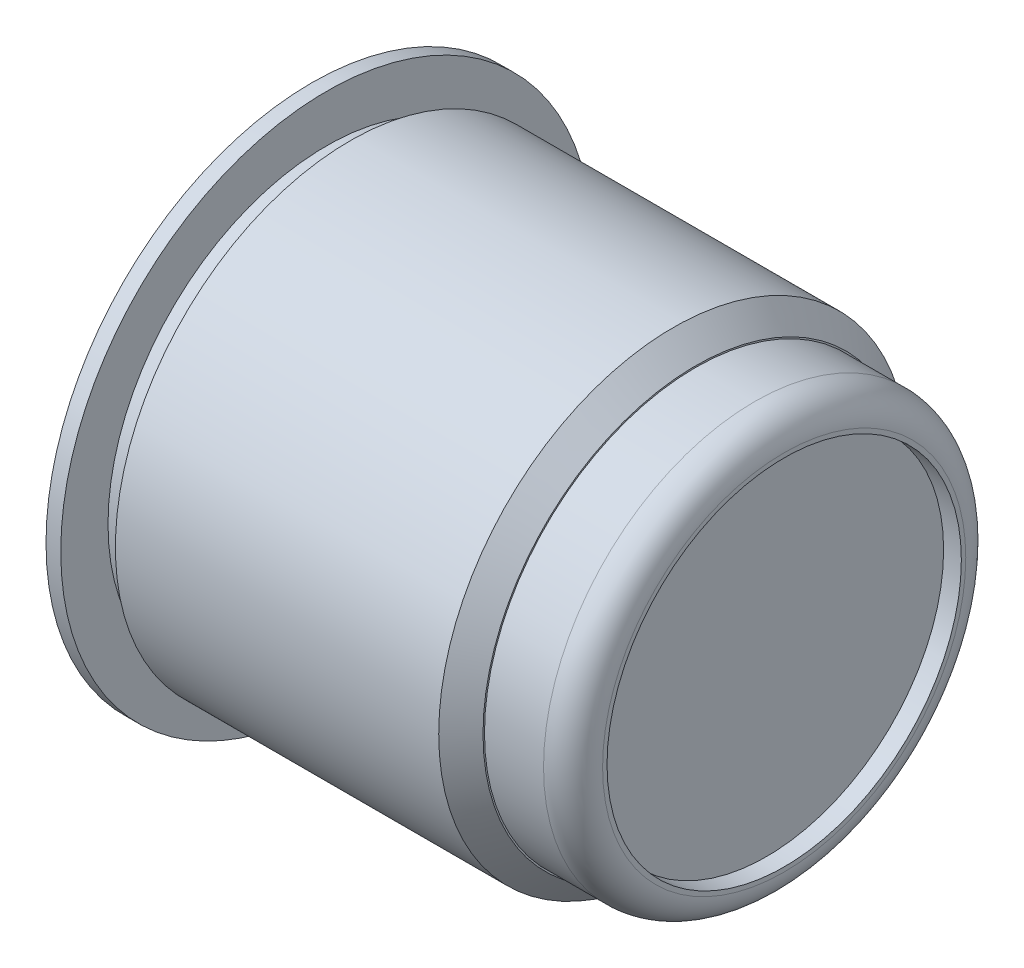
ISO-10303-21;
HEADER;
FILE_DESCRIPTION(('STEP AP214'),'2;1');
FILE_NAME('part.step','',(''),(''),'','','');
FILE_SCHEMA(('AUTOMOTIVE_DESIGN { 1 0 10303 214 1 1 1 1 }'));
ENDSEC;
DATA;
#1=APPLICATION_CONTEXT('core data for automotive mechanical design processes');
#2=APPLICATION_PROTOCOL_DEFINITION('international standard','automotive_design',2000,#1);
#3=PRODUCT_CONTEXT('',#1,'mechanical');
#4=PRODUCT('Part','Part','',(#3));
#5=PRODUCT_RELATED_PRODUCT_CATEGORY('part','',(#4));
#6=PRODUCT_DEFINITION_FORMATION('','',#4);
#7=PRODUCT_DEFINITION_CONTEXT('part definition',#1,'design');
#8=PRODUCT_DEFINITION('design','',#6,#7);
#9=PRODUCT_DEFINITION_SHAPE('','',#8);
#10=(LENGTH_UNIT() NAMED_UNIT(*) SI_UNIT(.MILLI.,.METRE.));
#11=(NAMED_UNIT(*) PLANE_ANGLE_UNIT() SI_UNIT($,.RADIAN.));
#12=(NAMED_UNIT(*) SI_UNIT($,.STERADIAN.) SOLID_ANGLE_UNIT());
#13=UNCERTAINTY_MEASURE_WITH_UNIT(LENGTH_MEASURE(1.E-05),#10,'distance_accuracy_value','');
#14=(GEOMETRIC_REPRESENTATION_CONTEXT(3) GLOBAL_UNCERTAINTY_ASSIGNED_CONTEXT((#13)) GLOBAL_UNIT_ASSIGNED_CONTEXT((#10,
#11,#12)) REPRESENTATION_CONTEXT('',''));
#15=CARTESIAN_POINT('',(0.,0.,0.));
#16=DIRECTION('',(0.,0.,1.));
#17=DIRECTION('',(1.,0.,0.));
#18=AXIS2_PLACEMENT_3D('',#15,#16,#17);
#19=CARTESIAN_POINT('',(12.5,0.,0.));
#20=DIRECTION('',(1.,0.,0.));
#21=DIRECTION('',(0.,0.,-1.));
#22=AXIS2_PLACEMENT_3D('',#19,#20,#21);
#23=PLANE('',#22);
#24=CARTESIAN_POINT('',(12.5,0.,0.));
#25=DIRECTION('',(-1.,0.,0.));
#26=DIRECTION('',(0.,0.,1.));
#27=AXIS2_PLACEMENT_3D('',#24,#25,#26);
#28=CIRCLE('',#27,5.95);
#29=CARTESIAN_POINT('',(12.5,0.,5.95));
#30=VERTEX_POINT('',#29);
#31=EDGE_CURVE('E17',#30,#30,#28,.T.);
#32=ORIENTED_EDGE('',*,*,#31,.T.);
#33=EDGE_LOOP('',(#32));
#34=FACE_BOUND('',#33,.T.);
#35=ADVANCED_FACE('F14',(#34),#23,.F.);
#36=CARTESIAN_POINT('',(-1.,0.,0.));
#37=DIRECTION('',(-1.,0.,0.));
#38=DIRECTION('',(0.,0.,1.));
#39=AXIS2_PLACEMENT_3D('',#36,#37,#38);
#40=CYLINDRICAL_SURFACE('',#39,5.95);
#41=CARTESIAN_POINT('',(-1.5,0.,0.));
#42=DIRECTION('',(-1.,0.,0.));
#43=DIRECTION('',(0.,0.,1.));
#44=AXIS2_PLACEMENT_3D('',#41,#42,#43);
#45=CIRCLE('',#44,5.95);
#46=CARTESIAN_POINT('',(-1.5,0.,5.95));
#47=VERTEX_POINT('',#46);
#48=EDGE_CURVE('E86',#47,#47,#45,.F.);
#49=ORIENTED_EDGE('',*,*,#48,.F.);
#50=EDGE_LOOP('',(#49));
#51=FACE_BOUND('',#50,.T.);
#52=ORIENTED_EDGE('',*,*,#31,.F.);
#53=EDGE_LOOP('',(#52));
#54=FACE_BOUND('',#53,.T.);
#55=ADVANCED_FACE('F94',(#51,#54),#40,.F.);
#56=CARTESIAN_POINT('',(14.9,0.,0.));
#57=DIRECTION('',(-1.,0.,0.));
#58=DIRECTION('',(0.,0.,1.));
#59=AXIS2_PLACEMENT_3D('',#56,#57,#58);
#60=PLANE('',#59);
#61=CARTESIAN_POINT('',(14.9,0.,0.));
#62=DIRECTION('',(-1.,0.,0.));
#63=DIRECTION('',(0.,0.,1.));
#64=AXIS2_PLACEMENT_3D('',#61,#62,#63);
#65=CIRCLE('',#64,6.);
#66=CARTESIAN_POINT('',(14.9,0.,6.));
#67=VERTEX_POINT('',#66);
#68=EDGE_CURVE('E84',#67,#67,#65,.F.);
#69=ORIENTED_EDGE('',*,*,#68,.T.);
#70=EDGE_LOOP('',(#69));
#71=FACE_BOUND('',#70,.T.);
#72=ADVANCED_FACE('F96',(#71),#60,.F.);
#73=CARTESIAN_POINT('',(-1.5,0.,6.475));
#74=DIRECTION('',(-1.,0.,0.));
#75=DIRECTION('',(0.,0.,1.));
#76=AXIS2_PLACEMENT_3D('',#73,#74,#75);
#77=PLANE('',#76);
#78=ORIENTED_EDGE('',*,*,#48,.T.);
#79=EDGE_LOOP('',(#78));
#80=FACE_BOUND('',#79,.T.);
#81=CARTESIAN_POINT('',(-1.5000000012651,0.,0.));
#82=DIRECTION('',(1.,0.,0.));
#83=DIRECTION('',(0.,1.,0.));
#84=AXIS2_PLACEMENT_3D('',#81,#82,#83);
#85=CIRCLE('',#84,7.00000000063255);
#86=CARTESIAN_POINT('',(-1.5000000012651,7.00000000063255,0.));
#87=VERTEX_POINT('',#86);
#88=EDGE_CURVE('E81',#87,#87,#85,.T.);
#89=ORIENTED_EDGE('',*,*,#88,.F.);
#90=EDGE_LOOP('',(#89));
#91=FACE_BOUND('',#90,.T.);
#92=ADVANCED_FACE('F103',(#80,#91),#77,.T.);
#93=CARTESIAN_POINT('',(15.5,0.,0.));
#94=DIRECTION('',(-1.,0.,0.));
#95=DIRECTION('',(0.,0.,1.));
#96=AXIS2_PLACEMENT_3D('',#93,#94,#95);
#97=CYLINDRICAL_SURFACE('',#96,6.);
#98=CARTESIAN_POINT('',(15.5,0.,0.));
#99=DIRECTION('',(-1.,0.,0.));
#100=DIRECTION('',(0.,0.,1.));
#101=AXIS2_PLACEMENT_3D('',#98,#99,#100);
#102=CIRCLE('',#101,6.);
#103=CARTESIAN_POINT('',(15.5,0.,6.));
#104=VERTEX_POINT('',#103);
#105=EDGE_CURVE('E78',#104,#104,#102,.F.);
#106=ORIENTED_EDGE('',*,*,#105,.T.);
#107=EDGE_LOOP('',(#106));
#108=FACE_BOUND('',#107,.T.);
#109=ORIENTED_EDGE('',*,*,#68,.F.);
#110=EDGE_LOOP('',(#109));
#111=FACE_BOUND('',#110,.T.);
#112=ADVANCED_FACE('F172',(#108,#111),#97,.F.);
#113=CARTESIAN_POINT('',(-0.499999998734898,0.,0.));
#114=DIRECTION('',(1.,0.,0.));
#115=DIRECTION('',(0.,1.,0.));
#116=AXIS2_PLACEMENT_3D('',#113,#114,#115);
#117=CONICAL_SURFACE('',#116,8.99999999936745,1.10714871652899);
#118=CARTESIAN_POINT('',(-0.5,0.,0.));
#119=DIRECTION('',(-1.,0.,0.));
#120=DIRECTION('',(0.,0.,1.));
#121=AXIS2_PLACEMENT_3D('',#118,#119,#120);
#122=CIRCLE('',#121,9.);
#123=CARTESIAN_POINT('',(-0.5,0.,9.));
#124=VERTEX_POINT('',#123);
#125=EDGE_CURVE('E40',#124,#124,#122,.F.);
#126=ORIENTED_EDGE('',*,*,#125,.F.);
#127=EDGE_LOOP('',(#126));
#128=FACE_BOUND('',#127,.T.);
#129=ORIENTED_EDGE('',*,*,#88,.T.);
#130=EDGE_LOOP('',(#129));
#131=FACE_BOUND('',#130,.T.);
#132=ADVANCED_FACE('F168',(#128,#131),#117,.T.);
#133=CARTESIAN_POINT('',(15.5,0.,0.));
#134=DIRECTION('',(-1.,0.,0.));
#135=DIRECTION('',(0.,0.,1.));
#136=AXIS2_PLACEMENT_3D('',#133,#134,#135);
#137=PLANE('',#136);
#138=ORIENTED_EDGE('',*,*,#105,.F.);
#139=EDGE_LOOP('',(#138));
#140=FACE_BOUND('',#139,.T.);
#141=CARTESIAN_POINT('',(15.5,0.,0.));
#142=DIRECTION('',(-1.,0.,0.));
#143=DIRECTION('',(0.,0.,1.));
#144=AXIS2_PLACEMENT_3D('',#141,#142,#143);
#145=CIRCLE('',#144,6.15);
#146=CARTESIAN_POINT('',(15.5,0.,6.15));
#147=VERTEX_POINT('',#146);
#148=EDGE_CURVE('E77',#147,#147,#145,.T.);
#149=ORIENTED_EDGE('',*,*,#148,.F.);
#150=EDGE_LOOP('',(#149));
#151=FACE_BOUND('',#150,.T.);
#152=ADVANCED_FACE('F150',(#140,#151),#137,.F.);
#153=CARTESIAN_POINT('',(0.,0.,0.));
#154=DIRECTION('',(-1.,0.,0.));
#155=DIRECTION('',(0.,0.,1.));
#156=AXIS2_PLACEMENT_3D('',#153,#154,#155);
#157=CYLINDRICAL_SURFACE('',#156,9.);
#158=CARTESIAN_POINT('',(0.,0.,0.));
#159=DIRECTION('',(-1.,0.,0.));
#160=DIRECTION('',(0.,0.,1.));
#161=AXIS2_PLACEMENT_3D('',#158,#159,#160);
#162=CIRCLE('',#161,9.);
#163=CARTESIAN_POINT('',(0.,0.,9.));
#164=VERTEX_POINT('',#163);
#165=EDGE_CURVE('E35',#164,#164,#162,.T.);
#166=ORIENTED_EDGE('',*,*,#165,.T.);
#167=EDGE_LOOP('',(#166));
#168=FACE_BOUND('',#167,.T.);
#169=ORIENTED_EDGE('',*,*,#125,.T.);
#170=EDGE_LOOP('',(#169));
#171=FACE_BOUND('',#170,.T.);
#172=ADVANCED_FACE('F49',(#168,#171),#157,.T.);
#173=CARTESIAN_POINT('',(14.5,0.,0.));
#174=DIRECTION('',(1.,0.,0.));
#175=DIRECTION('',(0.,0.,-1.));
#176=AXIS2_PLACEMENT_3D('',#173,#174,#175);
#177=TOROIDAL_SURFACE('',#176,6.15,1.);
#178=ORIENTED_EDGE('',*,*,#148,.T.);
#179=EDGE_LOOP('',(#178));
#180=FACE_BOUND('',#179,.T.);
#181=CARTESIAN_POINT('',(14.5,0.,0.));
#182=DIRECTION('',(1.,0.,0.));
#183=DIRECTION('',(0.,0.,-1.));
#184=AXIS2_PLACEMENT_3D('',#181,#182,#183);
#185=CIRCLE('',#184,7.15);
#186=CARTESIAN_POINT('',(14.5,0.,-7.15));
#187=VERTEX_POINT('',#186);
#188=EDGE_CURVE('E31',#187,#187,#185,.F.);
#189=ORIENTED_EDGE('',*,*,#188,.F.);
#190=EDGE_LOOP('',(#189));
#191=FACE_BOUND('',#190,.T.);
#192=ADVANCED_FACE('F43',(#180,#191),#177,.T.);
#193=CARTESIAN_POINT('',(0.,0.,0.));
#194=DIRECTION('',(-1.,0.,0.));
#195=DIRECTION('',(0.,0.,1.));
#196=AXIS2_PLACEMENT_3D('',#193,#194,#195);
#197=PLANE('',#196);
#198=CARTESIAN_POINT('',(0.,0.,0.));
#199=DIRECTION('',(1.,0.,0.));
#200=DIRECTION('',(0.,0.,-1.));
#201=AXIS2_PLACEMENT_3D('',#198,#199,#200);
#202=CIRCLE('',#201,7.4);
#203=CARTESIAN_POINT('',(0.,0.,-7.4));
#204=VERTEX_POINT('',#203);
#205=EDGE_CURVE('E34',#204,#204,#202,.T.);
#206=ORIENTED_EDGE('',*,*,#205,.F.);
#207=EDGE_LOOP('',(#206));
#208=FACE_BOUND('',#207,.T.);
#209=ORIENTED_EDGE('',*,*,#165,.F.);
#210=EDGE_LOOP('',(#209));
#211=FACE_BOUND('',#210,.T.);
#212=ADVANCED_FACE('F48',(#208,#211),#197,.F.);
#213=CARTESIAN_POINT('',(13.5,0.,0.));
#214=DIRECTION('',(1.,0.,0.));
#215=DIRECTION('',(0.,0.,-1.));
#216=AXIS2_PLACEMENT_3D('',#213,#214,#215);
#217=CYLINDRICAL_SURFACE('',#216,7.15);
#218=ORIENTED_EDGE('',*,*,#188,.T.);
#219=EDGE_LOOP('',(#218));
#220=FACE_BOUND('',#219,.T.);
#221=CARTESIAN_POINT('',(12.5,0.,0.));
#222=DIRECTION('',(1.,0.,0.));
#223=DIRECTION('',(0.,0.,-1.));
#224=AXIS2_PLACEMENT_3D('',#221,#222,#223);
#225=CIRCLE('',#224,7.15);
#226=CARTESIAN_POINT('',(12.5,0.,-7.15));
#227=VERTEX_POINT('',#226);
#228=EDGE_CURVE('E70',#227,#227,#225,.T.);
#229=ORIENTED_EDGE('',*,*,#228,.T.);
#230=EDGE_LOOP('',(#229));
#231=FACE_BOUND('',#230,.T.);
#232=ADVANCED_FACE('F127',(#220,#231),#217,.T.);
#233=CARTESIAN_POINT('',(0.,0.,0.));
#234=DIRECTION('',(1.,0.,0.));
#235=DIRECTION('',(0.,0.,-1.));
#236=AXIS2_PLACEMENT_3D('',#233,#234,#235);
#237=CYLINDRICAL_SURFACE('',#236,7.4);
#238=ORIENTED_EDGE('',*,*,#205,.T.);
#239=EDGE_LOOP('',(#238));
#240=FACE_BOUND('',#239,.T.);
#241=CARTESIAN_POINT('',(0.8,0.,0.));
#242=DIRECTION('',(1.,0.,0.));
#243=DIRECTION('',(0.,0.,-1.));
#244=AXIS2_PLACEMENT_3D('',#241,#242,#243);
#245=CIRCLE('',#244,7.4);
#246=CARTESIAN_POINT('',(0.8,0.,-7.4));
#247=VERTEX_POINT('',#246);
#248=EDGE_CURVE('E67',#247,#247,#245,.T.);
#249=ORIENTED_EDGE('',*,*,#248,.F.);
#250=EDGE_LOOP('',(#249));
#251=FACE_BOUND('',#250,.T.);
#252=ADVANCED_FACE('F124',(#240,#251),#237,.T.);
#253=CARTESIAN_POINT('',(12.5,0.,7.55));
#254=DIRECTION('',(-1.,0.,0.));
#255=DIRECTION('',(0.,0.,1.));
#256=AXIS2_PLACEMENT_3D('',#253,#254,#255);
#257=PLANE('',#256);
#258=ORIENTED_EDGE('',*,*,#228,.F.);
#259=EDGE_LOOP('',(#258));
#260=FACE_BOUND('',#259,.T.);
#261=CARTESIAN_POINT('',(12.5000000003365,0.,0.));
#262=DIRECTION('',(-1.,0.,0.));
#263=DIRECTION('',(0.,0.,1.));
#264=AXIS2_PLACEMENT_3D('',#261,#262,#263);
#265=CIRCLE('',#264,7.20000000033654);
#266=CARTESIAN_POINT('',(12.5000000003365,0.,7.20000000033654));
#267=VERTEX_POINT('',#266);
#268=EDGE_CURVE('E26',#267,#267,#265,.T.);
#269=ORIENTED_EDGE('',*,*,#268,.F.);
#270=EDGE_LOOP('',(#269));
#271=FACE_BOUND('',#270,.T.);
#272=ADVANCED_FACE('F120',(#260,#271),#257,.F.);
#273=CARTESIAN_POINT('',(0.8,0.,0.));
#274=DIRECTION('',(-1.,0.,0.));
#275=DIRECTION('',(0.,0.,1.));
#276=AXIS2_PLACEMENT_3D('',#273,#274,#275);
#277=PLANE('',#276);
#278=ORIENTED_EDGE('',*,*,#248,.T.);
#279=EDGE_LOOP('',(#278));
#280=FACE_BOUND('',#279,.T.);
#281=CARTESIAN_POINT('',(0.8,0.,0.));
#282=DIRECTION('',(1.,0.,0.));
#283=DIRECTION('',(0.,0.,-1.));
#284=AXIS2_PLACEMENT_3D('',#281,#282,#283);
#285=CIRCLE('',#284,7.95);
#286=CARTESIAN_POINT('',(0.8,0.,-7.95));
#287=VERTEX_POINT('',#286);
#288=EDGE_CURVE('E21',#287,#287,#285,.T.);
#289=ORIENTED_EDGE('',*,*,#288,.F.);
#290=EDGE_LOOP('',(#289));
#291=FACE_BOUND('',#290,.T.);
#292=ADVANCED_FACE('F113',(#280,#291),#277,.T.);
#293=CARTESIAN_POINT('',(11.7499999996635,0.,0.));
#294=DIRECTION('',(-1.,0.,0.));
#295=DIRECTION('',(0.,0.,1.));
#296=AXIS2_PLACEMENT_3D('',#293,#294,#295);
#297=CONICAL_SURFACE('',#296,7.94999999966346,0.785398162500001);
#298=CARTESIAN_POINT('',(11.75,0.,0.));
#299=DIRECTION('',(1.,0.,0.));
#300=DIRECTION('',(0.,0.,-1.));
#301=AXIS2_PLACEMENT_3D('',#298,#299,#300);
#302=CIRCLE('',#301,7.95);
#303=CARTESIAN_POINT('',(11.75,0.,-7.95));
#304=VERTEX_POINT('',#303);
#305=EDGE_CURVE('E10',#304,#304,#302,.F.);
#306=ORIENTED_EDGE('',*,*,#305,.F.);
#307=EDGE_LOOP('',(#306));
#308=FACE_BOUND('',#307,.T.);
#309=ORIENTED_EDGE('',*,*,#268,.T.);
#310=EDGE_LOOP('',(#309));
#311=FACE_BOUND('',#310,.T.);
#312=ADVANCED_FACE('F108',(#308,#311),#297,.T.);
#313=CARTESIAN_POINT('',(0.,0.,0.));
#314=DIRECTION('',(1.,0.,0.));
#315=DIRECTION('',(0.,0.,-1.));
#316=AXIS2_PLACEMENT_3D('',#313,#314,#315);
#317=CYLINDRICAL_SURFACE('',#316,7.95);
#318=ORIENTED_EDGE('',*,*,#305,.T.);
#319=EDGE_LOOP('',(#318));
#320=FACE_BOUND('',#319,.T.);
#321=ORIENTED_EDGE('',*,*,#288,.T.);
#322=EDGE_LOOP('',(#321));
#323=FACE_BOUND('',#322,.T.);
#324=ADVANCED_FACE('F106',(#320,#323),#317,.T.);
#325=CLOSED_SHELL('',(#35,#55,#72,#92,#112,#132,#152,#172,#192,#212,#232,#252,#272,#292,#312,#324));
#326=MANIFOLD_SOLID_BREP('B1',#325);
#327=ADVANCED_BREP_SHAPE_REPRESENTATION('',(#18,#326),#14);
#328=SHAPE_DEFINITION_REPRESENTATION(#9,#327);
ENDSEC;
END-ISO-10303-21;
